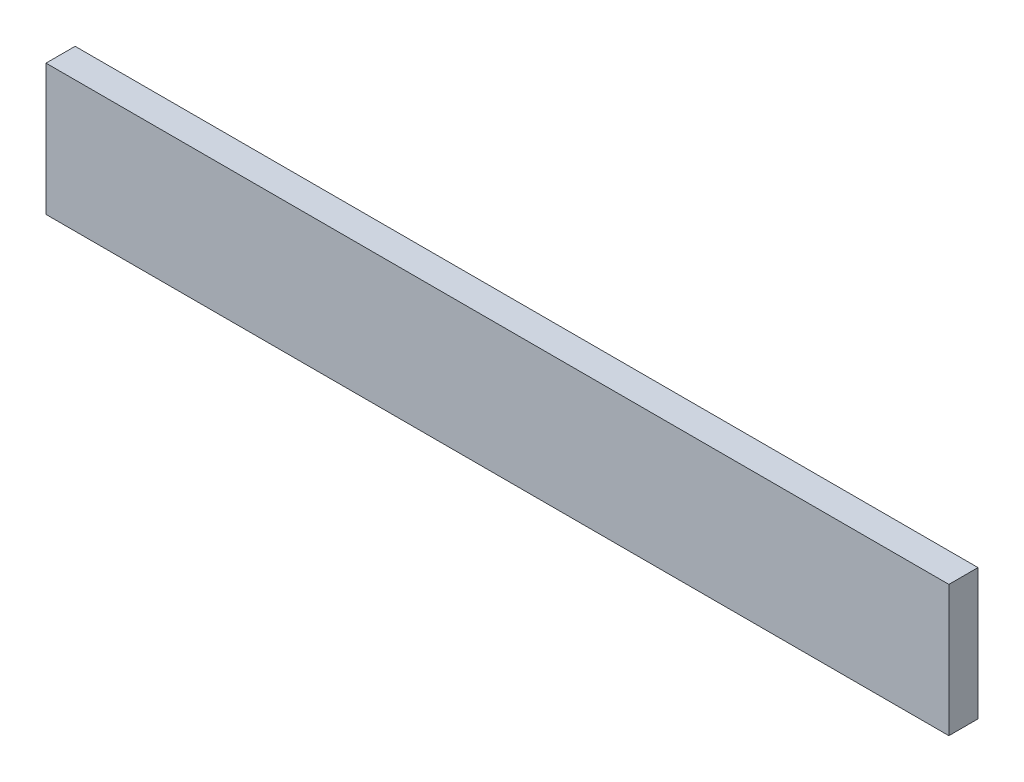
ISO-10303-21;
HEADER;
FILE_DESCRIPTION(('STEP AP214'),'2;1');
FILE_NAME('part.step','',(''),(''),'','','');
FILE_SCHEMA(('AUTOMOTIVE_DESIGN { 1 0 10303 214 1 1 1 1 }'));
ENDSEC;
DATA;
#1=APPLICATION_CONTEXT('core data for automotive mechanical design processes');
#2=APPLICATION_PROTOCOL_DEFINITION('international standard','automotive_design',2000,#1);
#3=PRODUCT_CONTEXT('',#1,'mechanical');
#4=PRODUCT('Part','Part','',(#3));
#5=PRODUCT_RELATED_PRODUCT_CATEGORY('part','',(#4));
#6=PRODUCT_DEFINITION_FORMATION('','',#4);
#7=PRODUCT_DEFINITION_CONTEXT('part definition',#1,'design');
#8=PRODUCT_DEFINITION('design','',#6,#7);
#9=PRODUCT_DEFINITION_SHAPE('','',#8);
#10=(LENGTH_UNIT() NAMED_UNIT(*) SI_UNIT(.MILLI.,.METRE.));
#11=(NAMED_UNIT(*) PLANE_ANGLE_UNIT() SI_UNIT($,.RADIAN.));
#12=(NAMED_UNIT(*) SI_UNIT($,.STERADIAN.) SOLID_ANGLE_UNIT());
#13=UNCERTAINTY_MEASURE_WITH_UNIT(LENGTH_MEASURE(1.E-05),#10,'distance_accuracy_value','');
#14=(GEOMETRIC_REPRESENTATION_CONTEXT(3) GLOBAL_UNCERTAINTY_ASSIGNED_CONTEXT((#13)) GLOBAL_UNIT_ASSIGNED_CONTEXT((#10,
#11,#12)) REPRESENTATION_CONTEXT('',''));
#15=CARTESIAN_POINT('',(0.,0.,0.));
#16=DIRECTION('',(0.,0.,1.));
#17=DIRECTION('',(1.,0.,0.));
#18=AXIS2_PLACEMENT_3D('',#15,#16,#17);
#19=CARTESIAN_POINT('',(-310.,-45.,20.));
#20=DIRECTION('',(1.,0.,0.));
#21=DIRECTION('',(0.,0.,-1.));
#22=AXIS2_PLACEMENT_3D('',#19,#20,#21);
#23=PLANE('',#22);
#24=DIRECTION('',(0.,-1.,0.));
#25=VECTOR('',#24,1.);
#26=CARTESIAN_POINT('',(-310.,-45.,0.));
#27=LINE('',#26,#25);
#28=CARTESIAN_POINT('',(-310.,45.,0.));
#29=VERTEX_POINT('',#28);
#30=CARTESIAN_POINT('',(-310.,-45.,0.));
#31=VERTEX_POINT('',#30);
#32=EDGE_CURVE('E107',#29,#31,#27,.T.);
#33=ORIENTED_EDGE('',*,*,#32,.T.);
#34=DIRECTION('',(0.,0.,-1.));
#35=VECTOR('',#34,1.);
#36=CARTESIAN_POINT('',(-310.,-45.,20.));
#37=LINE('',#36,#35);
#38=CARTESIAN_POINT('',(-310.,-45.,20.));
#39=VERTEX_POINT('',#38);
#40=EDGE_CURVE('E11',#39,#31,#37,.T.);
#41=ORIENTED_EDGE('',*,*,#40,.F.);
#42=DIRECTION('',(0.,-1.,0.));
#43=VECTOR('',#42,1.);
#44=CARTESIAN_POINT('',(-310.,-45.,20.));
#45=LINE('',#44,#43);
#46=CARTESIAN_POINT('',(-310.,45.,20.));
#47=VERTEX_POINT('',#46);
#48=EDGE_CURVE('E91',#47,#39,#45,.T.);
#49=ORIENTED_EDGE('',*,*,#48,.F.);
#50=DIRECTION('',(0.,0.,-1.));
#51=VECTOR('',#50,1.);
#52=CARTESIAN_POINT('',(-310.,45.,20.));
#53=LINE('',#52,#51);
#54=EDGE_CURVE('E103',#47,#29,#53,.T.);
#55=ORIENTED_EDGE('',*,*,#54,.T.);
#56=EDGE_LOOP('',(#33,#41,#49,#55));
#57=FACE_BOUND('',#56,.T.);
#58=ADVANCED_FACE('F39',(#57),#23,.F.);
#59=CARTESIAN_POINT('',(310.,-45.,20.));
#60=DIRECTION('',(0.,1.,0.));
#61=DIRECTION('',(-1.,0.,0.));
#62=AXIS2_PLACEMENT_3D('',#59,#60,#61);
#63=PLANE('',#62);
#64=DIRECTION('',(1.,0.,0.));
#65=VECTOR('',#64,1.);
#66=CARTESIAN_POINT('',(310.,-45.,0.));
#67=LINE('',#66,#65);
#68=CARTESIAN_POINT('',(310.,-45.,0.));
#69=VERTEX_POINT('',#68);
#70=EDGE_CURVE('E96',#31,#69,#67,.T.);
#71=ORIENTED_EDGE('',*,*,#70,.T.);
#72=DIRECTION('',(0.,0.,-1.));
#73=VECTOR('',#72,1.);
#74=CARTESIAN_POINT('',(310.,-45.,20.));
#75=LINE('',#74,#73);
#76=CARTESIAN_POINT('',(310.,-45.,20.));
#77=VERTEX_POINT('',#76);
#78=EDGE_CURVE('E48',#77,#69,#75,.T.);
#79=ORIENTED_EDGE('',*,*,#78,.F.);
#80=DIRECTION('',(1.,0.,0.));
#81=VECTOR('',#80,1.);
#82=CARTESIAN_POINT('',(310.,-45.,20.));
#83=LINE('',#82,#81);
#84=EDGE_CURVE('E86',#39,#77,#83,.T.);
#85=ORIENTED_EDGE('',*,*,#84,.F.);
#86=ORIENTED_EDGE('',*,*,#40,.T.);
#87=EDGE_LOOP('',(#71,#79,#85,#86));
#88=FACE_BOUND('',#87,.T.);
#89=ADVANCED_FACE('F95',(#88),#63,.F.);
#90=CARTESIAN_POINT('',(310.,-45.,20.));
#91=DIRECTION('',(-1.,0.,0.));
#92=DIRECTION('',(0.,0.,1.));
#93=AXIS2_PLACEMENT_3D('',#90,#91,#92);
#94=PLANE('',#93);
#95=DIRECTION('',(0.,1.,0.));
#96=VECTOR('',#95,1.);
#97=CARTESIAN_POINT('',(310.,-45.,0.));
#98=LINE('',#97,#96);
#99=CARTESIAN_POINT('',(310.,45.,0.));
#100=VERTEX_POINT('',#99);
#101=EDGE_CURVE('E73',#69,#100,#98,.T.);
#102=ORIENTED_EDGE('',*,*,#101,.T.);
#103=DIRECTION('',(0.,0.,-1.));
#104=VECTOR('',#103,1.);
#105=CARTESIAN_POINT('',(310.,45.,20.));
#106=LINE('',#105,#104);
#107=CARTESIAN_POINT('',(310.,45.,20.));
#108=VERTEX_POINT('',#107);
#109=EDGE_CURVE('E98',#108,#100,#106,.T.);
#110=ORIENTED_EDGE('',*,*,#109,.F.);
#111=DIRECTION('',(0.,1.,0.));
#112=VECTOR('',#111,1.);
#113=CARTESIAN_POINT('',(310.,-45.,20.));
#114=LINE('',#113,#112);
#115=EDGE_CURVE('E89',#77,#108,#114,.T.);
#116=ORIENTED_EDGE('',*,*,#115,.F.);
#117=ORIENTED_EDGE('',*,*,#78,.T.);
#118=EDGE_LOOP('',(#102,#110,#116,#117));
#119=FACE_BOUND('',#118,.T.);
#120=ADVANCED_FACE('F99',(#119),#94,.F.);
#121=CARTESIAN_POINT('',(310.,45.,20.));
#122=DIRECTION('',(0.,-1.,0.));
#123=DIRECTION('',(1.,0.,0.));
#124=AXIS2_PLACEMENT_3D('',#121,#122,#123);
#125=PLANE('',#124);
#126=DIRECTION('',(-1.,0.,0.));
#127=VECTOR('',#126,1.);
#128=CARTESIAN_POINT('',(310.,45.,0.));
#129=LINE('',#128,#127);
#130=EDGE_CURVE('E79',#100,#29,#129,.T.);
#131=ORIENTED_EDGE('',*,*,#130,.T.);
#132=ORIENTED_EDGE('',*,*,#54,.F.);
#133=DIRECTION('',(-1.,0.,0.));
#134=VECTOR('',#133,1.);
#135=CARTESIAN_POINT('',(310.,45.,20.));
#136=LINE('',#135,#134);
#137=EDGE_CURVE('E56',#108,#47,#136,.T.);
#138=ORIENTED_EDGE('',*,*,#137,.F.);
#139=ORIENTED_EDGE('',*,*,#109,.T.);
#140=EDGE_LOOP('',(#131,#132,#138,#139));
#141=FACE_BOUND('',#140,.T.);
#142=ADVANCED_FACE('F120',(#141),#125,.F.);
#143=CARTESIAN_POINT('',(0.,0.,20.));
#144=DIRECTION('',(0.,0.,1.));
#145=DIRECTION('',(1.,0.,0.));
#146=AXIS2_PLACEMENT_3D('',#143,#144,#145);
#147=PLANE('',#146);
#148=ORIENTED_EDGE('',*,*,#48,.T.);
#149=ORIENTED_EDGE('',*,*,#84,.T.);
#150=ORIENTED_EDGE('',*,*,#115,.T.);
#151=ORIENTED_EDGE('',*,*,#137,.T.);
#152=EDGE_LOOP('',(#148,#149,#150,#151));
#153=FACE_BOUND('',#152,.T.);
#154=ADVANCED_FACE('F87',(#153),#147,.T.);
#155=CARTESIAN_POINT('',(0.,0.,0.));
#156=DIRECTION('',(0.,0.,1.));
#157=DIRECTION('',(1.,0.,0.));
#158=AXIS2_PLACEMENT_3D('',#155,#156,#157);
#159=PLANE('',#158);
#160=ORIENTED_EDGE('',*,*,#32,.F.);
#161=ORIENTED_EDGE('',*,*,#130,.F.);
#162=ORIENTED_EDGE('',*,*,#101,.F.);
#163=ORIENTED_EDGE('',*,*,#70,.F.);
#164=EDGE_LOOP('',(#160,#161,#162,#163));
#165=FACE_BOUND('',#164,.T.);
#166=ADVANCED_FACE('F123',(#165),#159,.F.);
#167=CLOSED_SHELL('',(#58,#89,#120,#142,#154,#166));
#168=MANIFOLD_SOLID_BREP('B2',#167);
#169=ADVANCED_BREP_SHAPE_REPRESENTATION('',(#18,#168),#14);
#170=SHAPE_DEFINITION_REPRESENTATION(#9,#169);
ENDSEC;
END-ISO-10303-21;
